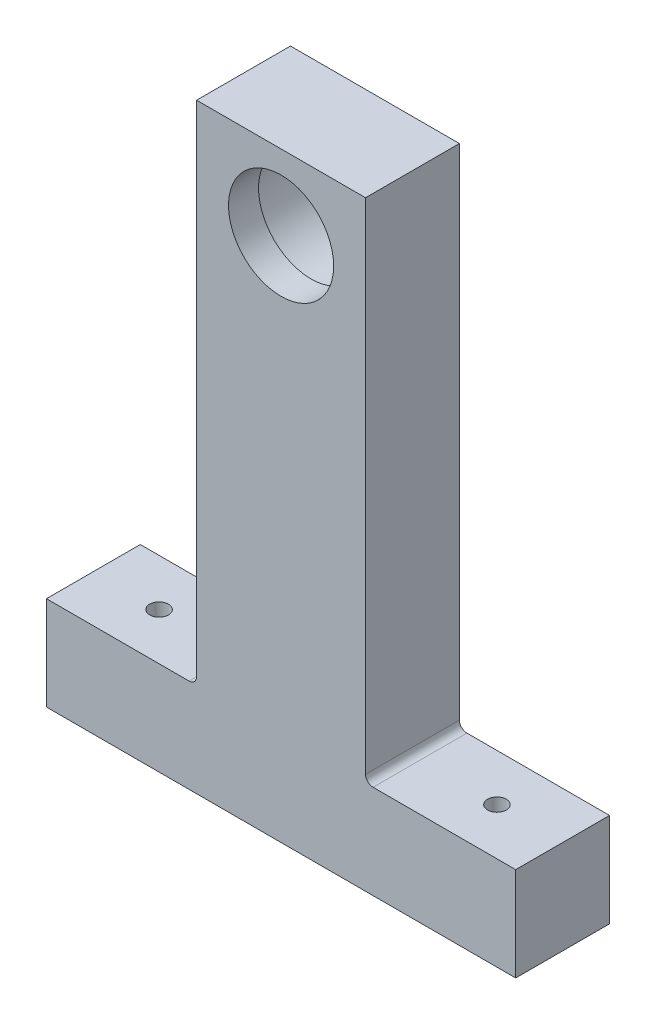
ISO-10303-21;
HEADER;
FILE_DESCRIPTION(('STEP AP214'),'2;1');
FILE_NAME('part.step','',(''),(''),'','','');
FILE_SCHEMA(('AUTOMOTIVE_DESIGN { 1 0 10303 214 1 1 1 1 }'));
ENDSEC;
DATA;
#1=APPLICATION_CONTEXT('core data for automotive mechanical design processes');
#2=APPLICATION_PROTOCOL_DEFINITION('international standard','automotive_design',2000,#1);
#3=PRODUCT_CONTEXT('',#1,'mechanical');
#4=PRODUCT('Part','Part','',(#3));
#5=PRODUCT_RELATED_PRODUCT_CATEGORY('part','',(#4));
#6=PRODUCT_DEFINITION_FORMATION('','',#4);
#7=PRODUCT_DEFINITION_CONTEXT('part definition',#1,'design');
#8=PRODUCT_DEFINITION('design','',#6,#7);
#9=PRODUCT_DEFINITION_SHAPE('','',#8);
#10=(LENGTH_UNIT() NAMED_UNIT(*) SI_UNIT(.MILLI.,.METRE.));
#11=(NAMED_UNIT(*) PLANE_ANGLE_UNIT() SI_UNIT($,.RADIAN.));
#12=(NAMED_UNIT(*) SI_UNIT($,.STERADIAN.) SOLID_ANGLE_UNIT());
#13=UNCERTAINTY_MEASURE_WITH_UNIT(LENGTH_MEASURE(1.E-05),#10,'distance_accuracy_value','');
#14=(GEOMETRIC_REPRESENTATION_CONTEXT(3) GLOBAL_UNCERTAINTY_ASSIGNED_CONTEXT((#13)) GLOBAL_UNIT_ASSIGNED_CONTEXT((#10,
#11,#12)) REPRESENTATION_CONTEXT('',''));
#15=CARTESIAN_POINT('',(0.,0.,0.));
#16=DIRECTION('',(0.,0.,1.));
#17=DIRECTION('',(1.,0.,0.));
#18=AXIS2_PLACEMENT_3D('',#15,#16,#17);
#19=CARTESIAN_POINT('',(0.,30.,25.));
#20=DIRECTION('',(0.,0.,-1.));
#21=DIRECTION('',(-1.,0.,0.));
#22=AXIS2_PLACEMENT_3D('',#19,#20,#21);
#23=CYLINDRICAL_SURFACE('',#22,16.);
#24=CARTESIAN_POINT('',(0.,30.,0.));
#25=DIRECTION('',(0.,0.,1.));
#26=DIRECTION('',(1.,0.,0.));
#27=AXIS2_PLACEMENT_3D('',#24,#25,#26);
#28=CIRCLE('',#27,16.);
#29=CARTESIAN_POINT('',(16.,30.,0.));
#30=VERTEX_POINT('',#29);
#31=EDGE_CURVE('E180',#30,#30,#28,.T.);
#32=ORIENTED_EDGE('',*,*,#31,.F.);
#33=EDGE_LOOP('',(#32));
#34=FACE_BOUND('',#33,.T.);
#35=CARTESIAN_POINT('',(0.,30.,17.));
#36=DIRECTION('',(0.,0.,1.));
#37=DIRECTION('',(1.,0.,0.));
#38=AXIS2_PLACEMENT_3D('',#35,#36,#37);
#39=CIRCLE('',#38,16.);
#40=CARTESIAN_POINT('',(16.,30.,17.));
#41=VERTEX_POINT('',#40);
#42=EDGE_CURVE('E188',#41,#41,#39,.T.);
#43=ORIENTED_EDGE('',*,*,#42,.T.);
#44=EDGE_LOOP('',(#43));
#45=FACE_BOUND('',#44,.T.);
#46=ADVANCED_FACE('F39',(#34,#45),#23,.F.);
#47=CARTESIAN_POINT('',(0.,0.,25.));
#48=DIRECTION('',(0.,0.,1.));
#49=DIRECTION('',(1.,0.,0.));
#50=AXIS2_PLACEMENT_3D('',#47,#48,#49);
#51=PLANE('',#50);
#52=DIRECTION('',(1.,0.,0.));
#53=VECTOR('',#52,1.);
#54=CARTESIAN_POINT('',(62.5000000000001,-110.,25.));
#55=LINE('',#54,#53);
#56=CARTESIAN_POINT('',(-62.5000000000001,-110.,25.));
#57=VERTEX_POINT('',#56);
#58=CARTESIAN_POINT('',(62.5000000000001,-110.,25.));
#59=VERTEX_POINT('',#58);
#60=EDGE_CURVE('E129',#57,#59,#55,.T.);
#61=ORIENTED_EDGE('',*,*,#60,.T.);
#62=DIRECTION('',(0.,1.,0.));
#63=VECTOR('',#62,1.);
#64=CARTESIAN_POINT('',(62.5000000000001,-85.,25.));
#65=LINE('',#64,#63);
#66=CARTESIAN_POINT('',(62.5000000000001,-85.,25.));
#67=VERTEX_POINT('',#66);
#68=EDGE_CURVE('E119',#59,#67,#65,.T.);
#69=ORIENTED_EDGE('',*,*,#68,.T.);
#70=DIRECTION('',(-1.,0.,0.));
#71=VECTOR('',#70,1.);
#72=CARTESIAN_POINT('',(22.5,-85.,25.));
#73=LINE('',#72,#71);
#74=CARTESIAN_POINT('',(24.5,-85.,25.));
#75=VERTEX_POINT('',#74);
#76=EDGE_CURVE('E128',#67,#75,#73,.T.);
#77=ORIENTED_EDGE('',*,*,#76,.T.);
#78=CARTESIAN_POINT('',(24.5,-83.,25.));
#79=DIRECTION('',(0.,0.,1.));
#80=DIRECTION('',(1.,0.,0.));
#81=AXIS2_PLACEMENT_3D('',#78,#79,#80);
#82=CIRCLE('',#81,2.);
#83=CARTESIAN_POINT('',(22.5,-83.,25.));
#84=VERTEX_POINT('',#83);
#85=EDGE_CURVE('E11',#75,#84,#82,.F.);
#86=ORIENTED_EDGE('',*,*,#85,.T.);
#87=DIRECTION('',(0.,1.,0.));
#88=VECTOR('',#87,1.);
#89=CARTESIAN_POINT('',(22.5,50.,25.));
#90=LINE('',#89,#88);
#91=CARTESIAN_POINT('',(22.5,50.,25.));
#92=VERTEX_POINT('',#91);
#93=EDGE_CURVE('E199',#84,#92,#90,.T.);
#94=ORIENTED_EDGE('',*,*,#93,.T.);
#95=DIRECTION('',(-1.,0.,0.));
#96=VECTOR('',#95,1.);
#97=CARTESIAN_POINT('',(-22.5,50.,25.));
#98=LINE('',#97,#96);
#99=CARTESIAN_POINT('',(-22.5,50.,25.));
#100=VERTEX_POINT('',#99);
#101=EDGE_CURVE('E202',#92,#100,#98,.T.);
#102=ORIENTED_EDGE('',*,*,#101,.T.);
#103=DIRECTION('',(0.,-1.,0.));
#104=VECTOR('',#103,1.);
#105=CARTESIAN_POINT('',(-22.5,50.,25.));
#106=LINE('',#105,#104);
#107=CARTESIAN_POINT('',(-22.5,-83.,25.));
#108=VERTEX_POINT('',#107);
#109=EDGE_CURVE('E205',#100,#108,#106,.T.);
#110=ORIENTED_EDGE('',*,*,#109,.T.);
#111=CARTESIAN_POINT('',(-24.5,-83.,25.));
#112=DIRECTION('',(0.,0.,1.));
#113=DIRECTION('',(1.,0.,0.));
#114=AXIS2_PLACEMENT_3D('',#111,#112,#113);
#115=CIRCLE('',#114,2.);
#116=CARTESIAN_POINT('',(-24.5,-85.,25.));
#117=VERTEX_POINT('',#116);
#118=EDGE_CURVE('E167',#108,#117,#115,.F.);
#119=ORIENTED_EDGE('',*,*,#118,.T.);
#120=DIRECTION('',(-1.,0.,0.));
#121=VECTOR('',#120,1.);
#122=CARTESIAN_POINT('',(-22.5,-85.,25.));
#123=LINE('',#122,#121);
#124=CARTESIAN_POINT('',(-62.5000000000001,-85.,25.));
#125=VERTEX_POINT('',#124);
#126=EDGE_CURVE('E209',#117,#125,#123,.T.);
#127=ORIENTED_EDGE('',*,*,#126,.T.);
#128=DIRECTION('',(0.,-1.,0.));
#129=VECTOR('',#128,1.);
#130=CARTESIAN_POINT('',(-62.5000000000001,-85.,25.));
#131=LINE('',#130,#129);
#132=EDGE_CURVE('E135',#125,#57,#131,.T.);
#133=ORIENTED_EDGE('',*,*,#132,.T.);
#134=EDGE_LOOP('',(#61,#69,#77,#86,#94,#102,#110,#119,#127,#133));
#135=FACE_BOUND('',#134,.T.);
#136=CARTESIAN_POINT('',(0.,30.,25.));
#137=DIRECTION('',(0.,0.,1.));
#138=DIRECTION('',(1.,0.,0.));
#139=AXIS2_PLACEMENT_3D('',#136,#137,#138);
#140=CIRCLE('',#139,14.);
#141=CARTESIAN_POINT('',(14.,30.,25.));
#142=VERTEX_POINT('',#141);
#143=EDGE_CURVE('E444',#142,#142,#140,.T.);
#144=ORIENTED_EDGE('',*,*,#143,.F.);
#145=EDGE_LOOP('',(#144));
#146=FACE_BOUND('',#145,.T.);
#147=ADVANCED_FACE('F132',(#135,#146),#51,.T.);
#148=CARTESIAN_POINT('',(0.,0.,0.));
#149=DIRECTION('',(0.,0.,1.));
#150=DIRECTION('',(1.,0.,0.));
#151=AXIS2_PLACEMENT_3D('',#148,#149,#150);
#152=PLANE('',#151);
#153=DIRECTION('',(0.,1.,0.));
#154=VECTOR('',#153,1.);
#155=CARTESIAN_POINT('',(62.5000000000001,-85.,0.));
#156=LINE('',#155,#154);
#157=CARTESIAN_POINT('',(62.5000000000001,-110.,0.));
#158=VERTEX_POINT('',#157);
#159=CARTESIAN_POINT('',(62.5000000000001,-85.,0.));
#160=VERTEX_POINT('',#159);
#161=EDGE_CURVE('E195',#158,#160,#156,.T.);
#162=ORIENTED_EDGE('',*,*,#161,.F.);
#163=DIRECTION('',(1.,0.,0.));
#164=VECTOR('',#163,1.);
#165=CARTESIAN_POINT('',(-22.5,-110.,0.));
#166=LINE('',#165,#164);
#167=CARTESIAN_POINT('',(-62.5000000000001,-110.,0.));
#168=VERTEX_POINT('',#167);
#169=EDGE_CURVE('E140',#168,#158,#166,.T.);
#170=ORIENTED_EDGE('',*,*,#169,.F.);
#171=DIRECTION('',(0.,-1.,0.));
#172=VECTOR('',#171,1.);
#173=CARTESIAN_POINT('',(-62.5000000000001,-85.,0.));
#174=LINE('',#173,#172);
#175=CARTESIAN_POINT('',(-62.5000000000001,-85.,0.));
#176=VERTEX_POINT('',#175);
#177=EDGE_CURVE('E233',#176,#168,#174,.T.);
#178=ORIENTED_EDGE('',*,*,#177,.F.);
#179=DIRECTION('',(-1.,0.,0.));
#180=VECTOR('',#179,1.);
#181=CARTESIAN_POINT('',(-22.5,-85.,0.));
#182=LINE('',#181,#180);
#183=CARTESIAN_POINT('',(-24.5,-85.,0.));
#184=VERTEX_POINT('',#183);
#185=EDGE_CURVE('E230',#184,#176,#182,.T.);
#186=ORIENTED_EDGE('',*,*,#185,.F.);
#187=CARTESIAN_POINT('',(-24.5,-83.,0.));
#188=DIRECTION('',(0.,0.,1.));
#189=DIRECTION('',(1.,0.,0.));
#190=AXIS2_PLACEMENT_3D('',#187,#188,#189);
#191=CIRCLE('',#190,2.);
#192=CARTESIAN_POINT('',(-22.5,-83.,0.));
#193=VERTEX_POINT('',#192);
#194=EDGE_CURVE('E164',#184,#193,#191,.T.);
#195=ORIENTED_EDGE('',*,*,#194,.T.);
#196=DIRECTION('',(0.,-1.,0.));
#197=VECTOR('',#196,1.);
#198=CARTESIAN_POINT('',(-22.5,50.,0.));
#199=LINE('',#198,#197);
#200=CARTESIAN_POINT('',(-22.5,50.,0.));
#201=VERTEX_POINT('',#200);
#202=EDGE_CURVE('E226',#201,#193,#199,.T.);
#203=ORIENTED_EDGE('',*,*,#202,.F.);
#204=DIRECTION('',(-1.,0.,0.));
#205=VECTOR('',#204,1.);
#206=CARTESIAN_POINT('',(-22.5,50.,0.));
#207=LINE('',#206,#205);
#208=CARTESIAN_POINT('',(22.5,50.,0.));
#209=VERTEX_POINT('',#208);
#210=EDGE_CURVE('E223',#209,#201,#207,.T.);
#211=ORIENTED_EDGE('',*,*,#210,.F.);
#212=DIRECTION('',(0.,1.,0.));
#213=VECTOR('',#212,1.);
#214=CARTESIAN_POINT('',(22.5,50.,0.));
#215=LINE('',#214,#213);
#216=CARTESIAN_POINT('',(22.5,-83.,0.));
#217=VERTEX_POINT('',#216);
#218=EDGE_CURVE('E220',#217,#209,#215,.T.);
#219=ORIENTED_EDGE('',*,*,#218,.F.);
#220=CARTESIAN_POINT('',(24.5,-83.,0.));
#221=DIRECTION('',(0.,0.,1.));
#222=DIRECTION('',(1.,0.,0.));
#223=AXIS2_PLACEMENT_3D('',#220,#221,#222);
#224=CIRCLE('',#223,2.);
#225=CARTESIAN_POINT('',(24.5,-85.,0.));
#226=VERTEX_POINT('',#225);
#227=EDGE_CURVE('E49',#217,#226,#224,.T.);
#228=ORIENTED_EDGE('',*,*,#227,.T.);
#229=DIRECTION('',(-1.,0.,0.));
#230=VECTOR('',#229,1.);
#231=CARTESIAN_POINT('',(22.5,-85.,0.));
#232=LINE('',#231,#230);
#233=EDGE_CURVE('E217',#160,#226,#232,.T.);
#234=ORIENTED_EDGE('',*,*,#233,.F.);
#235=EDGE_LOOP('',(#162,#170,#178,#186,#195,#203,#211,#219,#228,#234));
#236=FACE_BOUND('',#235,.T.);
#237=ORIENTED_EDGE('',*,*,#31,.T.);
#238=EDGE_LOOP('',(#237));
#239=FACE_BOUND('',#238,.T.);
#240=ADVANCED_FACE('F259',(#236,#239),#152,.F.);
#241=CARTESIAN_POINT('',(62.5000000000001,-85.,25.));
#242=DIRECTION('',(-1.,0.,0.));
#243=DIRECTION('',(0.,0.,1.));
#244=AXIS2_PLACEMENT_3D('',#241,#242,#243);
#245=PLANE('',#244);
#246=ORIENTED_EDGE('',*,*,#161,.T.);
#247=DIRECTION('',(0.,0.,-1.));
#248=VECTOR('',#247,1.);
#249=CARTESIAN_POINT('',(62.5000000000001,-85.,25.));
#250=LINE('',#249,#248);
#251=EDGE_CURVE('E125',#67,#160,#250,.T.);
#252=ORIENTED_EDGE('',*,*,#251,.F.);
#253=ORIENTED_EDGE('',*,*,#68,.F.);
#254=DIRECTION('',(0.,0.,-1.));
#255=VECTOR('',#254,1.);
#256=CARTESIAN_POINT('',(62.5000000000001,-110.,25.));
#257=LINE('',#256,#255);
#258=EDGE_CURVE('E123',#59,#158,#257,.T.);
#259=ORIENTED_EDGE('',*,*,#258,.T.);
#260=EDGE_LOOP('',(#246,#252,#253,#259));
#261=FACE_BOUND('',#260,.T.);
#262=ADVANCED_FACE('F121',(#261),#245,.F.);
#263=CARTESIAN_POINT('',(22.5,-85.,25.));
#264=DIRECTION('',(0.,-1.,0.));
#265=DIRECTION('',(0.,0.,-1.));
#266=AXIS2_PLACEMENT_3D('',#263,#264,#265);
#267=PLANE('',#266);
#268=CARTESIAN_POINT('',(45.,-85.,12.5));
#269=DIRECTION('',(0.,1.,0.));
#270=DIRECTION('',(0.,0.,1.));
#271=AXIS2_PLACEMENT_3D('',#268,#269,#270);
#272=CIRCLE('',#271,2.5);
#273=CARTESIAN_POINT('',(45.,-85.,15.));
#274=VERTEX_POINT('',#273);
#275=EDGE_CURVE('E182',#274,#274,#272,.T.);
#276=ORIENTED_EDGE('',*,*,#275,.F.);
#277=EDGE_LOOP('',(#276));
#278=FACE_BOUND('',#277,.T.);
#279=ORIENTED_EDGE('',*,*,#233,.T.);
#280=DIRECTION('',(0.,0.,-1.));
#281=VECTOR('',#280,1.);
#282=CARTESIAN_POINT('',(24.5,-85.,25.));
#283=LINE('',#282,#281);
#284=EDGE_CURVE('E57',#226,#75,#283,.F.);
#285=ORIENTED_EDGE('',*,*,#284,.T.);
#286=ORIENTED_EDGE('',*,*,#76,.F.);
#287=ORIENTED_EDGE('',*,*,#251,.T.);
#288=EDGE_LOOP('',(#279,#285,#286,#287));
#289=FACE_BOUND('',#288,.T.);
#290=ADVANCED_FACE('F277',(#278,#289),#267,.F.);
#291=CARTESIAN_POINT('',(22.5,50.,25.));
#292=DIRECTION('',(-1.,0.,0.));
#293=DIRECTION('',(0.,-1.,0.));
#294=AXIS2_PLACEMENT_3D('',#291,#292,#293);
#295=PLANE('',#294);
#296=ORIENTED_EDGE('',*,*,#93,.F.);
#297=DIRECTION('',(0.,0.,-1.));
#298=VECTOR('',#297,1.);
#299=CARTESIAN_POINT('',(22.5,-83.,0.));
#300=LINE('',#299,#298);
#301=EDGE_CURVE('E158',#84,#217,#300,.T.);
#302=ORIENTED_EDGE('',*,*,#301,.T.);
#303=ORIENTED_EDGE('',*,*,#218,.T.);
#304=DIRECTION('',(0.,0.,-1.));
#305=VECTOR('',#304,1.);
#306=CARTESIAN_POINT('',(22.5,50.,25.));
#307=LINE('',#306,#305);
#308=EDGE_CURVE('E152',#92,#209,#307,.T.);
#309=ORIENTED_EDGE('',*,*,#308,.F.);
#310=EDGE_LOOP('',(#296,#302,#303,#309));
#311=FACE_BOUND('',#310,.T.);
#312=ADVANCED_FACE('F281',(#311),#295,.F.);
#313=CARTESIAN_POINT('',(-22.5,50.,25.));
#314=DIRECTION('',(0.,-1.,0.));
#315=DIRECTION('',(0.,0.,-1.));
#316=AXIS2_PLACEMENT_3D('',#313,#314,#315);
#317=PLANE('',#316);
#318=ORIENTED_EDGE('',*,*,#210,.T.);
#319=DIRECTION('',(0.,0.,-1.));
#320=VECTOR('',#319,1.);
#321=CARTESIAN_POINT('',(-22.5,50.,25.));
#322=LINE('',#321,#320);
#323=EDGE_CURVE('E245',#100,#201,#322,.T.);
#324=ORIENTED_EDGE('',*,*,#323,.F.);
#325=ORIENTED_EDGE('',*,*,#101,.F.);
#326=ORIENTED_EDGE('',*,*,#308,.T.);
#327=EDGE_LOOP('',(#318,#324,#325,#326));
#328=FACE_BOUND('',#327,.T.);
#329=ADVANCED_FACE('F254',(#328),#317,.F.);
#330=CARTESIAN_POINT('',(-22.5,50.,25.));
#331=DIRECTION('',(1.,0.,0.));
#332=DIRECTION('',(0.,1.,0.));
#333=AXIS2_PLACEMENT_3D('',#330,#331,#332);
#334=PLANE('',#333);
#335=ORIENTED_EDGE('',*,*,#202,.T.);
#336=DIRECTION('',(0.,0.,-1.));
#337=VECTOR('',#336,1.);
#338=CARTESIAN_POINT('',(-22.5,-83.,25.));
#339=LINE('',#338,#337);
#340=EDGE_CURVE('E150',#193,#108,#339,.F.);
#341=ORIENTED_EDGE('',*,*,#340,.T.);
#342=ORIENTED_EDGE('',*,*,#109,.F.);
#343=ORIENTED_EDGE('',*,*,#323,.T.);
#344=EDGE_LOOP('',(#335,#341,#342,#343));
#345=FACE_BOUND('',#344,.T.);
#346=ADVANCED_FACE('F264',(#345),#334,.F.);
#347=CARTESIAN_POINT('',(-22.5,-85.,25.));
#348=DIRECTION('',(0.,-1.,0.));
#349=DIRECTION('',(0.,0.,-1.));
#350=AXIS2_PLACEMENT_3D('',#347,#348,#349);
#351=PLANE('',#350);
#352=CARTESIAN_POINT('',(-45.,-85.,12.5));
#353=DIRECTION('',(0.,1.,0.));
#354=DIRECTION('',(0.,0.,1.));
#355=AXIS2_PLACEMENT_3D('',#352,#353,#354);
#356=CIRCLE('',#355,2.5);
#357=CARTESIAN_POINT('',(-45.,-85.,15.));
#358=VERTEX_POINT('',#357);
#359=EDGE_CURVE('E174',#358,#358,#356,.T.);
#360=ORIENTED_EDGE('',*,*,#359,.F.);
#361=EDGE_LOOP('',(#360));
#362=FACE_BOUND('',#361,.T.);
#363=ORIENTED_EDGE('',*,*,#126,.F.);
#364=DIRECTION('',(0.,0.,-1.));
#365=VECTOR('',#364,1.);
#366=CARTESIAN_POINT('',(-24.5,-85.,0.));
#367=LINE('',#366,#365);
#368=EDGE_CURVE('E145',#117,#184,#367,.T.);
#369=ORIENTED_EDGE('',*,*,#368,.T.);
#370=ORIENTED_EDGE('',*,*,#185,.T.);
#371=DIRECTION('',(0.,0.,-1.));
#372=VECTOR('',#371,1.);
#373=CARTESIAN_POINT('',(-62.5000000000001,-85.,25.));
#374=LINE('',#373,#372);
#375=EDGE_CURVE('E241',#125,#176,#374,.T.);
#376=ORIENTED_EDGE('',*,*,#375,.F.);
#377=EDGE_LOOP('',(#363,#369,#370,#376));
#378=FACE_BOUND('',#377,.T.);
#379=ADVANCED_FACE('F273',(#362,#378),#351,.F.);
#380=CARTESIAN_POINT('',(-62.5000000000001,-85.,25.));
#381=DIRECTION('',(1.,0.,0.));
#382=DIRECTION('',(0.,0.,-1.));
#383=AXIS2_PLACEMENT_3D('',#380,#381,#382);
#384=PLANE('',#383);
#385=ORIENTED_EDGE('',*,*,#177,.T.);
#386=DIRECTION('',(0.,0.,-1.));
#387=VECTOR('',#386,1.);
#388=CARTESIAN_POINT('',(-62.5000000000001,-110.,25.));
#389=LINE('',#388,#387);
#390=EDGE_CURVE('E214',#57,#168,#389,.T.);
#391=ORIENTED_EDGE('',*,*,#390,.F.);
#392=ORIENTED_EDGE('',*,*,#132,.F.);
#393=ORIENTED_EDGE('',*,*,#375,.T.);
#394=EDGE_LOOP('',(#385,#391,#392,#393));
#395=FACE_BOUND('',#394,.T.);
#396=ADVANCED_FACE('F276',(#395),#384,.F.);
#397=CARTESIAN_POINT('',(-22.5,-110.,25.));
#398=DIRECTION('',(0.,1.,0.));
#399=DIRECTION('',(0.,0.,1.));
#400=AXIS2_PLACEMENT_3D('',#397,#398,#399);
#401=PLANE('',#400);
#402=CARTESIAN_POINT('',(-45.,-110.,12.5));
#403=DIRECTION('',(0.,1.,0.));
#404=DIRECTION('',(0.,0.,1.));
#405=AXIS2_PLACEMENT_3D('',#402,#403,#404);
#406=CIRCLE('',#405,2.5);
#407=CARTESIAN_POINT('',(-45.,-110.,15.));
#408=VERTEX_POINT('',#407);
#409=EDGE_CURVE('E43',#408,#408,#406,.T.);
#410=ORIENTED_EDGE('',*,*,#409,.T.);
#411=EDGE_LOOP('',(#410));
#412=FACE_BOUND('',#411,.T.);
#413=CARTESIAN_POINT('',(45.,-110.,12.5));
#414=DIRECTION('',(0.,1.,0.));
#415=DIRECTION('',(0.,0.,1.));
#416=AXIS2_PLACEMENT_3D('',#413,#414,#415);
#417=CIRCLE('',#416,2.5);
#418=CARTESIAN_POINT('',(45.,-110.,15.));
#419=VERTEX_POINT('',#418);
#420=EDGE_CURVE('E171',#419,#419,#417,.T.);
#421=ORIENTED_EDGE('',*,*,#420,.T.);
#422=EDGE_LOOP('',(#421));
#423=FACE_BOUND('',#422,.T.);
#424=ORIENTED_EDGE('',*,*,#169,.T.);
#425=ORIENTED_EDGE('',*,*,#258,.F.);
#426=ORIENTED_EDGE('',*,*,#60,.F.);
#427=ORIENTED_EDGE('',*,*,#390,.T.);
#428=EDGE_LOOP('',(#424,#425,#426,#427));
#429=FACE_BOUND('',#428,.T.);
#430=ADVANCED_FACE('F142',(#412,#423,#429),#401,.F.);
#431=CARTESIAN_POINT('',(-24.5,-83.,25.));
#432=DIRECTION('',(0.,0.,1.));
#433=DIRECTION('',(1.,0.,0.));
#434=AXIS2_PLACEMENT_3D('',#431,#432,#433);
#435=CYLINDRICAL_SURFACE('',#434,2.);
#436=ORIENTED_EDGE('',*,*,#118,.F.);
#437=ORIENTED_EDGE('',*,*,#340,.F.);
#438=ORIENTED_EDGE('',*,*,#194,.F.);
#439=ORIENTED_EDGE('',*,*,#368,.F.);
#440=EDGE_LOOP('',(#436,#437,#438,#439));
#441=FACE_BOUND('',#440,.T.);
#442=ADVANCED_FACE('F268',(#441),#435,.F.);
#443=CARTESIAN_POINT('',(24.5,-83.,25.));
#444=DIRECTION('',(0.,0.,1.));
#445=DIRECTION('',(1.,0.,0.));
#446=AXIS2_PLACEMENT_3D('',#443,#444,#445);
#447=CYLINDRICAL_SURFACE('',#446,2.);
#448=ORIENTED_EDGE('',*,*,#85,.F.);
#449=ORIENTED_EDGE('',*,*,#284,.F.);
#450=ORIENTED_EDGE('',*,*,#227,.F.);
#451=ORIENTED_EDGE('',*,*,#301,.F.);
#452=EDGE_LOOP('',(#448,#449,#450,#451));
#453=FACE_BOUND('',#452,.T.);
#454=ADVANCED_FACE('F41',(#453),#447,.F.);
#455=CARTESIAN_POINT('',(45.,-115.,12.5));
#456=DIRECTION('',(0.,1.,0.));
#457=DIRECTION('',(0.,0.,1.));
#458=AXIS2_PLACEMENT_3D('',#455,#456,#457);
#459=CYLINDRICAL_SURFACE('',#458,2.5);
#460=ORIENTED_EDGE('',*,*,#275,.T.);
#461=EDGE_LOOP('',(#460));
#462=FACE_BOUND('',#461,.T.);
#463=ORIENTED_EDGE('',*,*,#420,.F.);
#464=EDGE_LOOP('',(#463));
#465=FACE_BOUND('',#464,.T.);
#466=ADVANCED_FACE('F301',(#462,#465),#459,.F.);
#467=CARTESIAN_POINT('',(-45.,-115.,12.5));
#468=DIRECTION('',(0.,1.,0.));
#469=DIRECTION('',(0.,0.,1.));
#470=AXIS2_PLACEMENT_3D('',#467,#468,#469);
#471=CYLINDRICAL_SURFACE('',#470,2.5);
#472=ORIENTED_EDGE('',*,*,#359,.T.);
#473=EDGE_LOOP('',(#472));
#474=FACE_BOUND('',#473,.T.);
#475=ORIENTED_EDGE('',*,*,#409,.F.);
#476=EDGE_LOOP('',(#475));
#477=FACE_BOUND('',#476,.T.);
#478=ADVANCED_FACE('F349',(#474,#477),#471,.F.);
#479=CARTESIAN_POINT('',(0.,30.,17.));
#480=DIRECTION('',(0.,0.,1.));
#481=DIRECTION('',(1.,0.,0.));
#482=AXIS2_PLACEMENT_3D('',#479,#480,#481);
#483=PLANE('',#482);
#484=CARTESIAN_POINT('',(0.,30.,17.));
#485=DIRECTION('',(0.,0.,1.));
#486=DIRECTION('',(1.,0.,0.));
#487=AXIS2_PLACEMENT_3D('',#484,#485,#486);
#488=CIRCLE('',#487,14.);
#489=CARTESIAN_POINT('',(14.,30.,17.));
#490=VERTEX_POINT('',#489);
#491=EDGE_CURVE('E441',#490,#490,#488,.T.);
#492=ORIENTED_EDGE('',*,*,#491,.T.);
#493=EDGE_LOOP('',(#492));
#494=FACE_BOUND('',#493,.T.);
#495=ORIENTED_EDGE('',*,*,#42,.F.);
#496=EDGE_LOOP('',(#495));
#497=FACE_BOUND('',#496,.T.);
#498=ADVANCED_FACE('F356',(#494,#497),#483,.F.);
#499=CARTESIAN_POINT('',(0.,30.,17.));
#500=DIRECTION('',(0.,0.,1.));
#501=DIRECTION('',(1.,0.,0.));
#502=AXIS2_PLACEMENT_3D('',#499,#500,#501);
#503=CYLINDRICAL_SURFACE('',#502,14.);
#504=ORIENTED_EDGE('',*,*,#491,.F.);
#505=EDGE_LOOP('',(#504));
#506=FACE_BOUND('',#505,.T.);
#507=ORIENTED_EDGE('',*,*,#143,.T.);
#508=EDGE_LOOP('',(#507));
#509=FACE_BOUND('',#508,.T.);
#510=ADVANCED_FACE('F362',(#506,#509),#503,.F.);
#511=CLOSED_SHELL('',(#46,#147,#240,#262,#290,#312,#329,#346,#379,#396,#430,#442,#454,#466,#478,
#498,#510));
#512=MANIFOLD_SOLID_BREP('B2',#511);
#513=ADVANCED_BREP_SHAPE_REPRESENTATION('',(#18,#512),#14);
#514=SHAPE_DEFINITION_REPRESENTATION(#9,#513);
ENDSEC;
END-ISO-10303-21;
